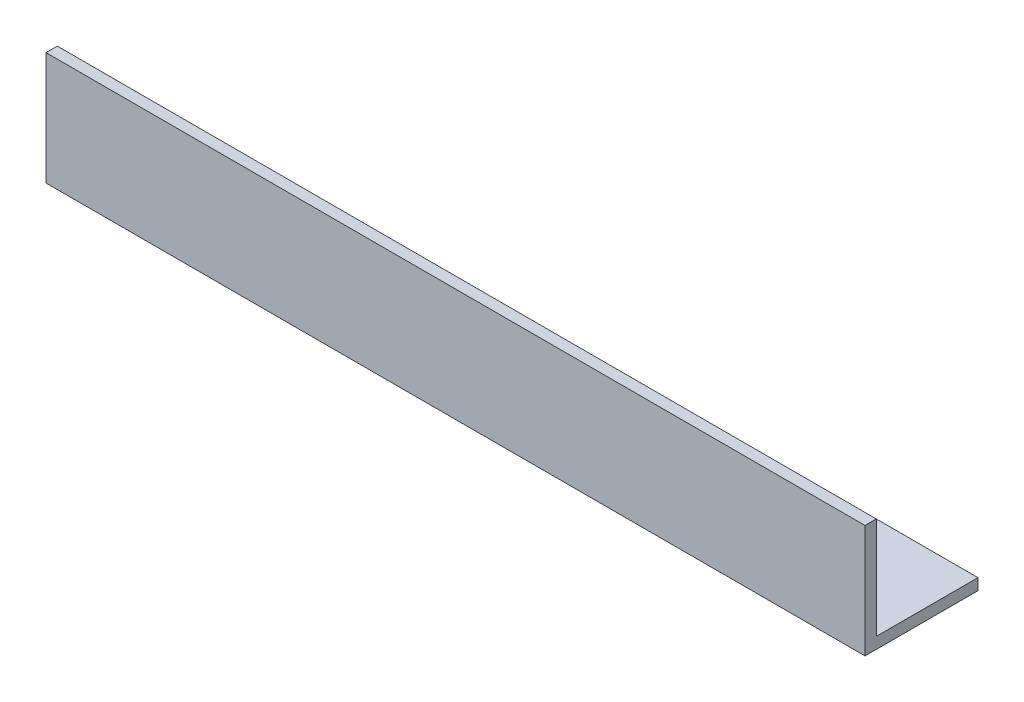
ISO-10303-21;
HEADER;
FILE_DESCRIPTION(('STEP AP214'),'2;1');
FILE_NAME('part.step','',(''),(''),'','','');
FILE_SCHEMA(('AUTOMOTIVE_DESIGN { 1 0 10303 214 1 1 1 1 }'));
ENDSEC;
DATA;
#1=APPLICATION_CONTEXT('core data for automotive mechanical design processes');
#2=APPLICATION_PROTOCOL_DEFINITION('international standard','automotive_design',2000,#1);
#3=PRODUCT_CONTEXT('',#1,'mechanical');
#4=PRODUCT('Part','Part','',(#3));
#5=PRODUCT_RELATED_PRODUCT_CATEGORY('part','',(#4));
#6=PRODUCT_DEFINITION_FORMATION('','',#4);
#7=PRODUCT_DEFINITION_CONTEXT('part definition',#1,'design');
#8=PRODUCT_DEFINITION('design','',#6,#7);
#9=PRODUCT_DEFINITION_SHAPE('','',#8);
#10=(LENGTH_UNIT() NAMED_UNIT(*) SI_UNIT(.MILLI.,.METRE.));
#11=(NAMED_UNIT(*) PLANE_ANGLE_UNIT() SI_UNIT($,.RADIAN.));
#12=(NAMED_UNIT(*) SI_UNIT($,.STERADIAN.) SOLID_ANGLE_UNIT());
#13=UNCERTAINTY_MEASURE_WITH_UNIT(LENGTH_MEASURE(1.E-05),#10,'distance_accuracy_value','');
#14=(GEOMETRIC_REPRESENTATION_CONTEXT(3) GLOBAL_UNCERTAINTY_ASSIGNED_CONTEXT((#13)) GLOBAL_UNIT_ASSIGNED_CONTEXT((#10,
#11,#12)) REPRESENTATION_CONTEXT('',''));
#15=CARTESIAN_POINT('',(0.,0.,0.));
#16=DIRECTION('',(0.,0.,1.));
#17=DIRECTION('',(1.,0.,0.));
#18=AXIS2_PLACEMENT_3D('',#15,#16,#17);
#19=CARTESIAN_POINT('',(145.,20.,-2.));
#20=DIRECTION('',(0.,-1.,0.));
#21=DIRECTION('',(0.,0.,-1.));
#22=AXIS2_PLACEMENT_3D('',#19,#20,#21);
#23=PLANE('',#22);
#24=DIRECTION('',(0.,0.,1.));
#25=VECTOR('',#24,1.);
#26=CARTESIAN_POINT('',(0.,20.,-2.));
#27=LINE('',#26,#25);
#28=CARTESIAN_POINT('',(0.,20.,-2.));
#29=VERTEX_POINT('',#28);
#30=CARTESIAN_POINT('',(0.,20.,0.));
#31=VERTEX_POINT('',#30);
#32=EDGE_CURVE('E132',#29,#31,#27,.T.);
#33=ORIENTED_EDGE('',*,*,#32,.T.);
#34=DIRECTION('',(-1.,0.,0.));
#35=VECTOR('',#34,1.);
#36=CARTESIAN_POINT('',(145.,20.,0.));
#37=LINE('',#36,#35);
#38=CARTESIAN_POINT('',(145.,20.,0.));
#39=VERTEX_POINT('',#38);
#40=EDGE_CURVE('E11',#39,#31,#37,.T.);
#41=ORIENTED_EDGE('',*,*,#40,.F.);
#42=DIRECTION('',(0.,0.,1.));
#43=VECTOR('',#42,1.);
#44=CARTESIAN_POINT('',(145.,20.,-2.));
#45=LINE('',#44,#43);
#46=CARTESIAN_POINT('',(145.,20.,-2.));
#47=VERTEX_POINT('',#46);
#48=EDGE_CURVE('E149',#47,#39,#45,.T.);
#49=ORIENTED_EDGE('',*,*,#48,.F.);
#50=DIRECTION('',(-1.,0.,0.));
#51=VECTOR('',#50,1.);
#52=CARTESIAN_POINT('',(145.,20.,-2.));
#53=LINE('',#52,#51);
#54=EDGE_CURVE('E128',#47,#29,#53,.T.);
#55=ORIENTED_EDGE('',*,*,#54,.T.);
#56=EDGE_LOOP('',(#33,#41,#49,#55));
#57=FACE_BOUND('',#56,.T.);
#58=ADVANCED_FACE('F43',(#57),#23,.F.);
#59=CARTESIAN_POINT('',(145.,20.,0.));
#60=DIRECTION('',(0.,0.,-1.));
#61=DIRECTION('',(-1.,0.,0.));
#62=AXIS2_PLACEMENT_3D('',#59,#60,#61);
#63=PLANE('',#62);
#64=DIRECTION('',(0.,-1.,0.));
#65=VECTOR('',#64,1.);
#66=CARTESIAN_POINT('',(0.,20.,0.));
#67=LINE('',#66,#65);
#68=CARTESIAN_POINT('',(0.,0.,0.));
#69=VERTEX_POINT('',#68);
#70=EDGE_CURVE('E136',#31,#69,#67,.T.);
#71=ORIENTED_EDGE('',*,*,#70,.T.);
#72=DIRECTION('',(-1.,0.,0.));
#73=VECTOR('',#72,1.);
#74=CARTESIAN_POINT('',(145.,0.,0.));
#75=LINE('',#74,#73);
#76=CARTESIAN_POINT('',(145.,0.,0.));
#77=VERTEX_POINT('',#76);
#78=EDGE_CURVE('E52',#77,#69,#75,.T.);
#79=ORIENTED_EDGE('',*,*,#78,.F.);
#80=DIRECTION('',(0.,-1.,0.));
#81=VECTOR('',#80,1.);
#82=CARTESIAN_POINT('',(145.,20.,0.));
#83=LINE('',#82,#81);
#84=EDGE_CURVE('E97',#39,#77,#83,.T.);
#85=ORIENTED_EDGE('',*,*,#84,.F.);
#86=ORIENTED_EDGE('',*,*,#40,.T.);
#87=EDGE_LOOP('',(#71,#79,#85,#86));
#88=FACE_BOUND('',#87,.T.);
#89=ADVANCED_FACE('F178',(#88),#63,.F.);
#90=CARTESIAN_POINT('',(145.,0.,0.));
#91=DIRECTION('',(0.,1.,0.));
#92=DIRECTION('',(0.,0.,1.));
#93=AXIS2_PLACEMENT_3D('',#90,#91,#92);
#94=PLANE('',#93);
#95=CARTESIAN_POINT('',(8.,0.,-11.));
#96=DIRECTION('',(0.,1.,0.));
#97=DIRECTION('',(0.,0.,1.));
#98=AXIS2_PLACEMENT_3D('',#95,#96,#97);
#99=CIRCLE('',#98,2.5);
#100=CARTESIAN_POINT('',(8.,0.,-8.5));
#101=VERTEX_POINT('',#100);
#102=EDGE_CURVE('E137',#101,#101,#99,.T.);
#103=ORIENTED_EDGE('',*,*,#102,.T.);
#104=EDGE_LOOP('',(#103));
#105=FACE_BOUND('',#104,.T.);
#106=CARTESIAN_POINT('',(40.,0.,-11.));
#107=DIRECTION('',(0.,1.,0.));
#108=DIRECTION('',(0.,0.,1.));
#109=AXIS2_PLACEMENT_3D('',#106,#107,#108);
#110=CIRCLE('',#109,2.5);
#111=CARTESIAN_POINT('',(40.,0.,-8.5));
#112=VERTEX_POINT('',#111);
#113=EDGE_CURVE('E285',#112,#112,#110,.T.);
#114=ORIENTED_EDGE('',*,*,#113,.T.);
#115=EDGE_LOOP('',(#114));
#116=FACE_BOUND('',#115,.T.);
#117=DIRECTION('',(0.,0.,-1.));
#118=VECTOR('',#117,1.);
#119=CARTESIAN_POINT('',(0.,0.,0.));
#120=LINE('',#119,#118);
#121=CARTESIAN_POINT('',(0.,0.,-20.));
#122=VERTEX_POINT('',#121);
#123=EDGE_CURVE('E140',#69,#122,#120,.T.);
#124=ORIENTED_EDGE('',*,*,#123,.T.);
#125=DIRECTION('',(-1.,0.,0.));
#126=VECTOR('',#125,1.);
#127=CARTESIAN_POINT('',(145.,0.,-20.));
#128=LINE('',#127,#126);
#129=CARTESIAN_POINT('',(145.,0.,-20.));
#130=VERTEX_POINT('',#129);
#131=EDGE_CURVE('E121',#130,#122,#128,.T.);
#132=ORIENTED_EDGE('',*,*,#131,.F.);
#133=DIRECTION('',(0.,0.,-1.));
#134=VECTOR('',#133,1.);
#135=CARTESIAN_POINT('',(145.,0.,0.));
#136=LINE('',#135,#134);
#137=EDGE_CURVE('E110',#77,#130,#136,.T.);
#138=ORIENTED_EDGE('',*,*,#137,.F.);
#139=ORIENTED_EDGE('',*,*,#78,.T.);
#140=EDGE_LOOP('',(#124,#132,#138,#139));
#141=FACE_BOUND('',#140,.T.);
#142=ADVANCED_FACE('F159',(#105,#116,#141),#94,.F.);
#143=CARTESIAN_POINT('',(145.,0.,-20.));
#144=DIRECTION('',(0.,0.,1.));
#145=DIRECTION('',(1.,0.,0.));
#146=AXIS2_PLACEMENT_3D('',#143,#144,#145);
#147=PLANE('',#146);
#148=DIRECTION('',(0.,1.,0.));
#149=VECTOR('',#148,1.);
#150=CARTESIAN_POINT('',(0.,0.,-20.));
#151=LINE('',#150,#149);
#152=CARTESIAN_POINT('',(0.,2.,-20.));
#153=VERTEX_POINT('',#152);
#154=EDGE_CURVE('E119',#122,#153,#151,.T.);
#155=ORIENTED_EDGE('',*,*,#154,.T.);
#156=DIRECTION('',(-1.,0.,0.));
#157=VECTOR('',#156,1.);
#158=CARTESIAN_POINT('',(145.,2.,-20.));
#159=LINE('',#158,#157);
#160=CARTESIAN_POINT('',(145.,2.,-20.));
#161=VERTEX_POINT('',#160);
#162=EDGE_CURVE('E116',#161,#153,#159,.T.);
#163=ORIENTED_EDGE('',*,*,#162,.F.);
#164=DIRECTION('',(0.,1.,0.));
#165=VECTOR('',#164,1.);
#166=CARTESIAN_POINT('',(145.,0.,-20.));
#167=LINE('',#166,#165);
#168=EDGE_CURVE('E104',#130,#161,#167,.T.);
#169=ORIENTED_EDGE('',*,*,#168,.F.);
#170=ORIENTED_EDGE('',*,*,#131,.T.);
#171=EDGE_LOOP('',(#155,#163,#169,#170));
#172=FACE_BOUND('',#171,.T.);
#173=ADVANCED_FACE('F117',(#172),#147,.F.);
#174=CARTESIAN_POINT('',(145.,2.,-20.));
#175=DIRECTION('',(0.,-1.,0.));
#176=DIRECTION('',(0.,0.,-1.));
#177=AXIS2_PLACEMENT_3D('',#174,#175,#176);
#178=PLANE('',#177);
#179=CARTESIAN_POINT('',(8.,2.,-11.));
#180=DIRECTION('',(0.,1.,0.));
#181=DIRECTION('',(0.,0.,1.));
#182=AXIS2_PLACEMENT_3D('',#179,#180,#181);
#183=CIRCLE('',#182,2.5);
#184=CARTESIAN_POINT('',(8.,2.,-8.5));
#185=VERTEX_POINT('',#184);
#186=EDGE_CURVE('E277',#185,#185,#183,.T.);
#187=ORIENTED_EDGE('',*,*,#186,.F.);
#188=EDGE_LOOP('',(#187));
#189=FACE_BOUND('',#188,.T.);
#190=CARTESIAN_POINT('',(40.,2.,-11.));
#191=DIRECTION('',(0.,1.,0.));
#192=DIRECTION('',(0.,0.,1.));
#193=AXIS2_PLACEMENT_3D('',#190,#191,#192);
#194=CIRCLE('',#193,2.5);
#195=CARTESIAN_POINT('',(40.,2.,-8.5));
#196=VERTEX_POINT('',#195);
#197=EDGE_CURVE('E279',#196,#196,#194,.T.);
#198=ORIENTED_EDGE('',*,*,#197,.F.);
#199=EDGE_LOOP('',(#198));
#200=FACE_BOUND('',#199,.T.);
#201=DIRECTION('',(0.,0.,1.));
#202=VECTOR('',#201,1.);
#203=CARTESIAN_POINT('',(0.,2.,-20.));
#204=LINE('',#203,#202);
#205=CARTESIAN_POINT('',(0.,2.,-2.));
#206=VERTEX_POINT('',#205);
#207=EDGE_CURVE('E83',#153,#206,#204,.T.);
#208=ORIENTED_EDGE('',*,*,#207,.T.);
#209=DIRECTION('',(-1.,0.,0.));
#210=VECTOR('',#209,1.);
#211=CARTESIAN_POINT('',(145.,2.,-2.));
#212=LINE('',#211,#210);
#213=CARTESIAN_POINT('',(145.,2.,-2.));
#214=VERTEX_POINT('',#213);
#215=EDGE_CURVE('E122',#214,#206,#212,.T.);
#216=ORIENTED_EDGE('',*,*,#215,.F.);
#217=DIRECTION('',(0.,0.,1.));
#218=VECTOR('',#217,1.);
#219=CARTESIAN_POINT('',(145.,2.,-20.));
#220=LINE('',#219,#218);
#221=EDGE_CURVE('E108',#161,#214,#220,.T.);
#222=ORIENTED_EDGE('',*,*,#221,.F.);
#223=ORIENTED_EDGE('',*,*,#162,.T.);
#224=EDGE_LOOP('',(#208,#216,#222,#223));
#225=FACE_BOUND('',#224,.T.);
#226=ADVANCED_FACE('F124',(#189,#200,#225),#178,.F.);
#227=CARTESIAN_POINT('',(145.,2.,-2.));
#228=DIRECTION('',(0.,0.,1.));
#229=DIRECTION('',(0.,-1.,0.));
#230=AXIS2_PLACEMENT_3D('',#227,#228,#229);
#231=PLANE('',#230);
#232=DIRECTION('',(0.,1.,0.));
#233=VECTOR('',#232,1.);
#234=CARTESIAN_POINT('',(0.,2.,-2.));
#235=LINE('',#234,#233);
#236=EDGE_CURVE('E89',#206,#29,#235,.T.);
#237=ORIENTED_EDGE('',*,*,#236,.T.);
#238=ORIENTED_EDGE('',*,*,#54,.F.);
#239=DIRECTION('',(0.,1.,0.));
#240=VECTOR('',#239,1.);
#241=CARTESIAN_POINT('',(145.,2.,-2.));
#242=LINE('',#241,#240);
#243=EDGE_CURVE('E60',#214,#47,#242,.T.);
#244=ORIENTED_EDGE('',*,*,#243,.F.);
#245=ORIENTED_EDGE('',*,*,#215,.T.);
#246=EDGE_LOOP('',(#237,#238,#244,#245));
#247=FACE_BOUND('',#246,.T.);
#248=ADVANCED_FACE('F166',(#247),#231,.F.);
#249=CARTESIAN_POINT('',(145.,0.,0.));
#250=DIRECTION('',(1.,0.,0.));
#251=DIRECTION('',(0.,0.,-1.));
#252=AXIS2_PLACEMENT_3D('',#249,#250,#251);
#253=PLANE('',#252);
#254=ORIENTED_EDGE('',*,*,#48,.T.);
#255=ORIENTED_EDGE('',*,*,#84,.T.);
#256=ORIENTED_EDGE('',*,*,#137,.T.);
#257=ORIENTED_EDGE('',*,*,#168,.T.);
#258=ORIENTED_EDGE('',*,*,#221,.T.);
#259=ORIENTED_EDGE('',*,*,#243,.T.);
#260=EDGE_LOOP('',(#254,#255,#256,#257,#258,#259));
#261=FACE_BOUND('',#260,.T.);
#262=ADVANCED_FACE('F106',(#261),#253,.T.);
#263=CARTESIAN_POINT('',(0.,0.,0.));
#264=DIRECTION('',(1.,0.,0.));
#265=DIRECTION('',(0.,0.,-1.));
#266=AXIS2_PLACEMENT_3D('',#263,#264,#265);
#267=PLANE('',#266);
#268=ORIENTED_EDGE('',*,*,#32,.F.);
#269=ORIENTED_EDGE('',*,*,#236,.F.);
#270=ORIENTED_EDGE('',*,*,#207,.F.);
#271=ORIENTED_EDGE('',*,*,#154,.F.);
#272=ORIENTED_EDGE('',*,*,#123,.F.);
#273=ORIENTED_EDGE('',*,*,#70,.F.);
#274=EDGE_LOOP('',(#268,#269,#270,#271,#272,#273));
#275=FACE_BOUND('',#274,.T.);
#276=ADVANCED_FACE('F162',(#275),#267,.F.);
#277=CARTESIAN_POINT('',(40.,0.,-11.));
#278=DIRECTION('',(0.,1.,0.));
#279=DIRECTION('',(0.,0.,1.));
#280=AXIS2_PLACEMENT_3D('',#277,#278,#279);
#281=CYLINDRICAL_SURFACE('',#280,2.5);
#282=ORIENTED_EDGE('',*,*,#113,.F.);
#283=EDGE_LOOP('',(#282));
#284=FACE_BOUND('',#283,.T.);
#285=ORIENTED_EDGE('',*,*,#197,.T.);
#286=EDGE_LOOP('',(#285));
#287=FACE_BOUND('',#286,.T.);
#288=ADVANCED_FACE('F207',(#284,#287),#281,.F.);
#289=CARTESIAN_POINT('',(8.,0.,-11.));
#290=DIRECTION('',(0.,1.,0.));
#291=DIRECTION('',(0.,0.,1.));
#292=AXIS2_PLACEMENT_3D('',#289,#290,#291);
#293=CYLINDRICAL_SURFACE('',#292,2.5);
#294=ORIENTED_EDGE('',*,*,#102,.F.);
#295=EDGE_LOOP('',(#294));
#296=FACE_BOUND('',#295,.T.);
#297=ORIENTED_EDGE('',*,*,#186,.T.);
#298=EDGE_LOOP('',(#297));
#299=FACE_BOUND('',#298,.T.);
#300=ADVANCED_FACE('F212',(#296,#299),#293,.F.);
#301=CLOSED_SHELL('',(#58,#89,#142,#173,#226,#248,#262,#276,#288,#300));
#302=MANIFOLD_SOLID_BREP('B2',#301);
#303=ADVANCED_BREP_SHAPE_REPRESENTATION('',(#18,#302),#14);
#304=SHAPE_DEFINITION_REPRESENTATION(#9,#303);
ENDSEC;
END-ISO-10303-21;
